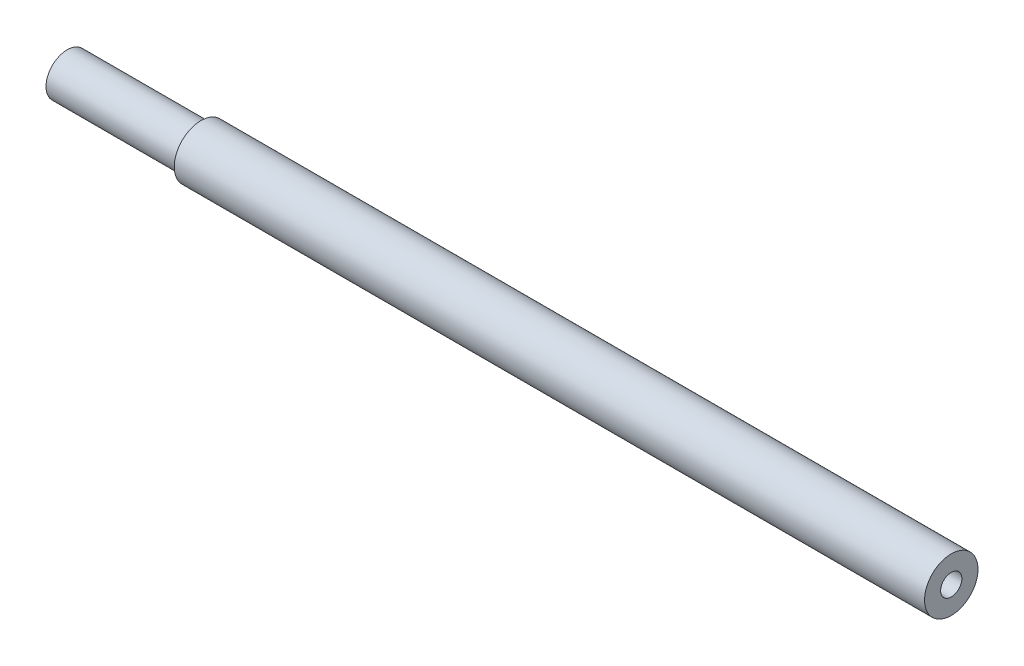
ISO-10303-21;
HEADER;
FILE_DESCRIPTION(('STEP AP214'),'2;1');
FILE_NAME('part.step','',(''),(''),'','','');
FILE_SCHEMA(('AUTOMOTIVE_DESIGN { 1 0 10303 214 1 1 1 1 }'));
ENDSEC;
DATA;
#1=APPLICATION_CONTEXT('core data for automotive mechanical design processes');
#2=APPLICATION_PROTOCOL_DEFINITION('international standard','automotive_design',2000,#1);
#3=PRODUCT_CONTEXT('',#1,'mechanical');
#4=PRODUCT('Part','Part','',(#3));
#5=PRODUCT_RELATED_PRODUCT_CATEGORY('part','',(#4));
#6=PRODUCT_DEFINITION_FORMATION('','',#4);
#7=PRODUCT_DEFINITION_CONTEXT('part definition',#1,'design');
#8=PRODUCT_DEFINITION('design','',#6,#7);
#9=PRODUCT_DEFINITION_SHAPE('','',#8);
#10=(LENGTH_UNIT() NAMED_UNIT(*) SI_UNIT(.MILLI.,.METRE.));
#11=(NAMED_UNIT(*) PLANE_ANGLE_UNIT() SI_UNIT($,.RADIAN.));
#12=(NAMED_UNIT(*) SI_UNIT($,.STERADIAN.) SOLID_ANGLE_UNIT());
#13=UNCERTAINTY_MEASURE_WITH_UNIT(LENGTH_MEASURE(1.E-05),#10,'distance_accuracy_value','');
#14=(GEOMETRIC_REPRESENTATION_CONTEXT(3) GLOBAL_UNCERTAINTY_ASSIGNED_CONTEXT((#13)) GLOBAL_UNIT_ASSIGNED_CONTEXT((#10,
#11,#12)) REPRESENTATION_CONTEXT('',''));
#15=CARTESIAN_POINT('',(0.,0.,0.));
#16=DIRECTION('',(0.,0.,1.));
#17=DIRECTION('',(1.,0.,0.));
#18=AXIS2_PLACEMENT_3D('',#15,#16,#17);
#19=CARTESIAN_POINT('',(-28.055,0.,0.));
#20=DIRECTION('',(1.,0.,0.));
#21=DIRECTION('',(0.,0.,-1.));
#22=AXIS2_PLACEMENT_3D('',#19,#20,#21);
#23=PLANE('',#22);
#24=CARTESIAN_POINT('',(-28.055,0.,0.));
#25=DIRECTION('',(1.,0.,0.));
#26=DIRECTION('',(0.,0.,-1.));
#27=AXIS2_PLACEMENT_3D('',#24,#25,#26);
#28=CIRCLE('',#27,2.);
#29=CARTESIAN_POINT('',(-28.055,0.,-2.));
#30=VERTEX_POINT('',#29);
#31=EDGE_CURVE('E43',#30,#30,#28,.T.);
#32=ORIENTED_EDGE('',*,*,#31,.F.);
#33=EDGE_LOOP('',(#32));
#34=FACE_BOUND('',#33,.T.);
#35=CARTESIAN_POINT('',(-28.055,0.,0.));
#36=DIRECTION('',(1.,0.,0.));
#37=DIRECTION('',(0.,0.,-1.));
#38=AXIS2_PLACEMENT_3D('',#35,#36,#37);
#39=CIRCLE('',#38,1.5875);
#40=CARTESIAN_POINT('',(-28.055,0.,-1.5875));
#41=VERTEX_POINT('',#40);
#42=EDGE_CURVE('E10',#41,#41,#39,.F.);
#43=ORIENTED_EDGE('',*,*,#42,.F.);
#44=EDGE_LOOP('',(#43));
#45=FACE_BOUND('',#44,.T.);
#46=ADVANCED_FACE('F32',(#34,#45),#23,.F.);
#47=CARTESIAN_POINT('',(28.055,0.,0.));
#48=DIRECTION('',(-1.,0.,0.));
#49=DIRECTION('',(0.,0.,1.));
#50=AXIS2_PLACEMENT_3D('',#47,#48,#49);
#51=CYLINDRICAL_SURFACE('',#50,2.);
#52=CARTESIAN_POINT('',(28.055,0.,0.));
#53=DIRECTION('',(1.,0.,0.));
#54=DIRECTION('',(0.,0.,-1.));
#55=AXIS2_PLACEMENT_3D('',#52,#53,#54);
#56=CIRCLE('',#55,2.);
#57=CARTESIAN_POINT('',(28.055,0.,-2.));
#58=VERTEX_POINT('',#57);
#59=EDGE_CURVE('E39',#58,#58,#56,.T.);
#60=ORIENTED_EDGE('',*,*,#59,.F.);
#61=EDGE_LOOP('',(#60));
#62=FACE_BOUND('',#61,.T.);
#63=ORIENTED_EDGE('',*,*,#31,.T.);
#64=EDGE_LOOP('',(#63));
#65=FACE_BOUND('',#64,.T.);
#66=ADVANCED_FACE('F34',(#62,#65),#51,.T.);
#67=CARTESIAN_POINT('',(28.055,0.,0.));
#68=DIRECTION('',(1.,0.,0.));
#69=DIRECTION('',(0.,0.,-1.));
#70=AXIS2_PLACEMENT_3D('',#67,#68,#69);
#71=PLANE('',#70);
#72=CARTESIAN_POINT('',(28.055,0.,0.));
#73=DIRECTION('',(1.,0.,0.));
#74=DIRECTION('',(0.,0.,-1.));
#75=AXIS2_PLACEMENT_3D('',#72,#73,#74);
#76=CIRCLE('',#75,0.795);
#77=CARTESIAN_POINT('',(28.055,0.,-0.795));
#78=VERTEX_POINT('',#77);
#79=EDGE_CURVE('E50',#78,#78,#76,.T.);
#80=ORIENTED_EDGE('',*,*,#79,.F.);
#81=EDGE_LOOP('',(#80));
#82=FACE_BOUND('',#81,.T.);
#83=ORIENTED_EDGE('',*,*,#59,.T.);
#84=EDGE_LOOP('',(#83));
#85=FACE_BOUND('',#84,.T.);
#86=ADVANCED_FACE('F78',(#82,#85),#71,.T.);
#87=CARTESIAN_POINT('',(21.055,0.,0.));
#88=DIRECTION('',(1.,0.,0.));
#89=DIRECTION('',(0.,0.,-1.));
#90=AXIS2_PLACEMENT_3D('',#87,#88,#89);
#91=CYLINDRICAL_SURFACE('',#90,0.795);
#92=CARTESIAN_POINT('',(21.055,0.,0.));
#93=DIRECTION('',(1.,0.,0.));
#94=DIRECTION('',(0.,0.,-1.));
#95=AXIS2_PLACEMENT_3D('',#92,#93,#94);
#96=CIRCLE('',#95,0.795);
#97=CARTESIAN_POINT('',(21.055,0.,-0.795));
#98=VERTEX_POINT('',#97);
#99=EDGE_CURVE('E48',#98,#98,#96,.T.);
#100=ORIENTED_EDGE('',*,*,#99,.F.);
#101=EDGE_LOOP('',(#100));
#102=FACE_BOUND('',#101,.T.);
#103=ORIENTED_EDGE('',*,*,#79,.T.);
#104=EDGE_LOOP('',(#103));
#105=FACE_BOUND('',#104,.T.);
#106=ADVANCED_FACE('F70',(#102,#105),#91,.F.);
#107=CARTESIAN_POINT('',(21.055,0.,0.));
#108=DIRECTION('',(1.,0.,0.));
#109=DIRECTION('',(0.,0.,-1.));
#110=AXIS2_PLACEMENT_3D('',#107,#108,#109);
#111=PLANE('',#110);
#112=ORIENTED_EDGE('',*,*,#99,.T.);
#113=EDGE_LOOP('',(#112));
#114=FACE_BOUND('',#113,.T.);
#115=ADVANCED_FACE('F63',(#114),#111,.T.);
#116=CARTESIAN_POINT('',(-38.055,0.,0.));
#117=DIRECTION('',(1.,0.,0.));
#118=DIRECTION('',(0.,0.,-1.));
#119=AXIS2_PLACEMENT_3D('',#116,#117,#118);
#120=CYLINDRICAL_SURFACE('',#119,1.5875);
#121=CARTESIAN_POINT('',(-38.055,0.,0.));
#122=DIRECTION('',(-1.,0.,0.));
#123=DIRECTION('',(0.,0.,1.));
#124=AXIS2_PLACEMENT_3D('',#121,#122,#123);
#125=CIRCLE('',#124,1.5875);
#126=CARTESIAN_POINT('',(-38.055,0.,1.5875));
#127=VERTEX_POINT('',#126);
#128=EDGE_CURVE('E53',#127,#127,#125,.T.);
#129=ORIENTED_EDGE('',*,*,#128,.F.);
#130=EDGE_LOOP('',(#129));
#131=FACE_BOUND('',#130,.T.);
#132=ORIENTED_EDGE('',*,*,#42,.T.);
#133=EDGE_LOOP('',(#132));
#134=FACE_BOUND('',#133,.T.);
#135=ADVANCED_FACE('F61',(#131,#134),#120,.T.);
#136=CARTESIAN_POINT('',(-38.055,0.,0.));
#137=DIRECTION('',(-1.,0.,0.));
#138=DIRECTION('',(0.,0.,1.));
#139=AXIS2_PLACEMENT_3D('',#136,#137,#138);
#140=PLANE('',#139);
#141=ORIENTED_EDGE('',*,*,#128,.T.);
#142=EDGE_LOOP('',(#141));
#143=FACE_BOUND('',#142,.T.);
#144=ADVANCED_FACE('F59',(#143),#140,.T.);
#145=CLOSED_SHELL('',(#46,#66,#86,#106,#115,#135,#144));
#146=MANIFOLD_SOLID_BREP('B2',#145);
#147=ADVANCED_BREP_SHAPE_REPRESENTATION('',(#18,#146),#14);
#148=SHAPE_DEFINITION_REPRESENTATION(#9,#147);
ENDSEC;
END-ISO-10303-21;
